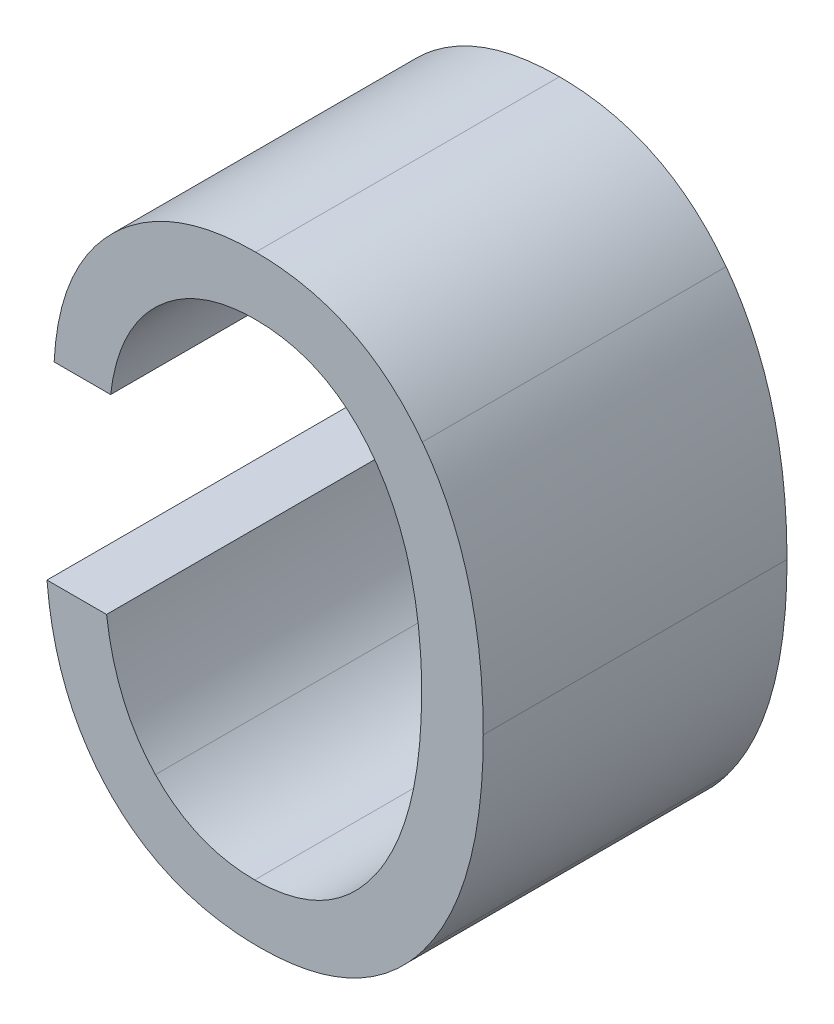
ISO-10303-21;
HEADER;
FILE_DESCRIPTION(('STEP AP214'),'2;1');
FILE_NAME('part.step','',(''),(''),'','','');
FILE_SCHEMA(('AUTOMOTIVE_DESIGN { 1 0 10303 214 1 1 1 1 }'));
ENDSEC;
DATA;
#1=APPLICATION_CONTEXT('core data for automotive mechanical design processes');
#2=APPLICATION_PROTOCOL_DEFINITION('international standard','automotive_design',2000,#1);
#3=PRODUCT_CONTEXT('',#1,'mechanical');
#4=PRODUCT('Part','Part','',(#3));
#5=PRODUCT_RELATED_PRODUCT_CATEGORY('part','',(#4));
#6=PRODUCT_DEFINITION_FORMATION('','',#4);
#7=PRODUCT_DEFINITION_CONTEXT('part definition',#1,'design');
#8=PRODUCT_DEFINITION('design','',#6,#7);
#9=PRODUCT_DEFINITION_SHAPE('','',#8);
#10=(LENGTH_UNIT() NAMED_UNIT(*) SI_UNIT(.MILLI.,.METRE.));
#11=(NAMED_UNIT(*) PLANE_ANGLE_UNIT() SI_UNIT($,.RADIAN.));
#12=(NAMED_UNIT(*) SI_UNIT($,.STERADIAN.) SOLID_ANGLE_UNIT());
#13=UNCERTAINTY_MEASURE_WITH_UNIT(LENGTH_MEASURE(1.E-05),#10,'distance_accuracy_value','');
#14=(GEOMETRIC_REPRESENTATION_CONTEXT(3) GLOBAL_UNCERTAINTY_ASSIGNED_CONTEXT((#13)) GLOBAL_UNIT_ASSIGNED_CONTEXT((#10,
#11,#12)) REPRESENTATION_CONTEXT('',''));
#15=CARTESIAN_POINT('',(0.,0.,0.));
#16=DIRECTION('',(0.,0.,1.));
#17=DIRECTION('',(1.,0.,0.));
#18=AXIS2_PLACEMENT_3D('',#15,#16,#17);
#19=CARTESIAN_POINT('',(-20.748700900759,-5.204237152856,-5.5));
#20=DIRECTION('',(0.,0.,1.));
#21=DIRECTION('',(0.,-1.,0.));
#22=AXIS2_PLACEMENT_3D('',#19,#20,#21);
#23=PLANE('',#22);
#24=DIRECTION('',(-1.,0.,0.));
#25=VECTOR('',#24,1.);
#26=CARTESIAN_POINT('',(-21.315617358079,-5.489666705857,-5.5));
#27=LINE('',#26,#25);
#28=CARTESIAN_POINT('',(-21.315617358079,-5.489666705857,-5.5));
#29=VERTEX_POINT('',#28);
#30=CARTESIAN_POINT('',(-21.511677135857,-5.489666705857,-5.5));
#31=VERTEX_POINT('',#30);
#32=EDGE_CURVE('E220',#29,#31,#27,.T.);
#33=ORIENTED_EDGE('',*,*,#32,.T.);
#34=CARTESIAN_POINT('',(50.6368316811641,55.9876875106243,-5.5));
#35=DIRECTION('',(0.,0.,1.));
#36=DIRECTION('',(-0.757876184757265,-0.652398412458041,0.));
#37=AXIS2_PLACEMENT_3D('',#34,#35,#36);
#38=ELLIPSE('',#37,94.9605156450385,7.90822990046057);
#39=CARTESIAN_POINT('',(-21.297865580301,-6.000615928079,-5.5));
#40=VERTEX_POINT('',#39);
#41=EDGE_CURVE('E351',#31,#40,#38,.T.);
#42=ORIENTED_EDGE('',*,*,#41,.T.);
#43=CARTESIAN_POINT('',(-21.297865580301,-6.000615928079,-5.5));
#44=CARTESIAN_POINT('',(-21.173256002523,-6.125011016968,-5.5));
#45=CARTESIAN_POINT('',(-21.011277380301,-6.187145061412,-5.5));
#46=CARTESIAN_POINT('',(-20.81177166919,-6.187145061412,-5.5));
#47=(BOUNDED_CURVE() B_SPLINE_CURVE(3,(#43,#44,#45,#46),.UNSPECIFIED.,.F.,
.F.) B_SPLINE_CURVE_WITH_KNOTS((4,4),(0.,1.),
.UNSPECIFIED.) CURVE() GEOMETRIC_REPRESENTATION_ITEM() RATIONAL_B_SPLINE_CURVE((1.,1.,1.,1.)) REPRESENTATION_ITEM(''));
#48=CARTESIAN_POINT('',(-20.81177166919,-6.187145061412,-5.5));
#49=VERTEX_POINT('',#48);
#50=EDGE_CURVE('E308',#40,#49,#47,.T.);
#51=ORIENTED_EDGE('',*,*,#50,.T.);
#52=CARTESIAN_POINT('',(-85.6003074763474,111.475848994198,-5.5));
#53=DIRECTION('',(0.,0.,1.));
#54=DIRECTION('',(-0.484502710728714,0.874789759483116,0.));
#55=AXIS2_PLACEMENT_3D('',#52,#53,#54);
#56=ELLIPSE('',#55,134.412425984334,8.97509897320417);
#57=CARTESIAN_POINT('',(-20.272673602523,-5.925753661412,-5.5));
#58=VERTEX_POINT('',#57);
#59=EDGE_CURVE('E388',#49,#58,#56,.T.);
#60=ORIENTED_EDGE('',*,*,#59,.T.);
#61=CARTESIAN_POINT('',(-335.159539741306,295.360115025311,-5.5));
#62=DIRECTION('',(0.,0.,1.));
#63=DIRECTION('',(-0.722391760181757,0.691484016316721,0.));
#64=AXIS2_PLACEMENT_3D('',#61,#62,#63);
#65=ELLIPSE('',#64,435.811574095691,18.4157328264147);
#66=CARTESIAN_POINT('',(-20.075417202523,-5.21274743919,-5.5));
#67=VERTEX_POINT('',#66);
#68=EDGE_CURVE('E342',#58,#67,#65,.T.);
#69=ORIENTED_EDGE('',*,*,#68,.T.);
#70=CARTESIAN_POINT('',(-20.075417202523,-5.21274743919,-5.5));
#71=CARTESIAN_POINT('',(-20.075417202523,-4.90106686141222,-5.5));
#72=CARTESIAN_POINT('',(-20.142092202523,-4.656535416968,-5.5));
#73=CARTESIAN_POINT('',(-20.275848602523,-4.478292328079,-5.5));
#74=(BOUNDED_CURVE() B_SPLINE_CURVE(3,(#70,#71,#72,#73),.UNSPECIFIED.,.F.,
.F.) B_SPLINE_CURVE_WITH_KNOTS((4,4),(0.,1.),
.UNSPECIFIED.) CURVE() GEOMETRIC_REPRESENTATION_ITEM() RATIONAL_B_SPLINE_CURVE((1.,1.,1.,1.)) REPRESENTATION_ITEM(''));
#75=CARTESIAN_POINT('',(-20.275848602523,-4.478292328079,-5.5));
#76=VERTEX_POINT('',#75);
#77=EDGE_CURVE('E376',#67,#76,#74,.T.);
#78=ORIENTED_EDGE('',*,*,#77,.T.);
#79=CARTESIAN_POINT('',(-264.103364811324,-443.415524832838,-5.5));
#80=DIRECTION('',(0.,0.,1.));
#81=DIRECTION('',(0.485128580811187,0.874442828365653,0.));
#82=AXIS2_PLACEMENT_3D('',#79,#80,#81);
#83=ELLIPSE('',#82,502.174176792857,17.47091635477);
#84=CARTESIAN_POINT('',(-20.824502713635,-4.211129483634,-5.5));
#85=VERTEX_POINT('',#84);
#86=EDGE_CURVE('E101',#76,#85,#83,.T.);
#87=ORIENTED_EDGE('',*,*,#86,.T.);
#88=CARTESIAN_POINT('',(11.7742779570349,-62.9549538033383,-5.5));
#89=DIRECTION('',(0.,0.,1.));
#90=DIRECTION('',(-0.489591961104544,0.871951668168487,0.));
#91=AXIS2_PLACEMENT_3D('',#88,#89,#90);
#92=ELLIPSE('',#91,67.276124785224,6.3488727408022);
#93=CARTESIAN_POINT('',(-21.29096806919,-4.388782728079,-5.5));
#94=VERTEX_POINT('',#93);
#95=EDGE_CURVE('E460',#85,#94,#92,.T.);
#96=ORIENTED_EDGE('',*,*,#95,.T.);
#97=CARTESIAN_POINT('',(28.7477985263709,-38.0166772489034,-5.5));
#98=DIRECTION('',(0.,0.,1.));
#99=DIRECTION('',(-0.831196791139272,0.555978321879349,0.));
#100=AXIS2_PLACEMENT_3D('',#97,#98,#99);
#101=ELLIPSE('',#100,60.3024170758194,6.08196527584888);
#102=CARTESIAN_POINT('',(-21.488089002523,-4.856091928079,-5.5));
#103=VERTEX_POINT('',#102);
#104=EDGE_CURVE('E313',#94,#103,#101,.T.);
#105=ORIENTED_EDGE('',*,*,#104,.T.);
#106=DIRECTION('',(1.,0.,0.));
#107=VECTOR('',#106,1.);
#108=CARTESIAN_POINT('',(-21.488089002523,-4.856091928079,-5.5));
#109=LINE('',#108,#107);
#110=CARTESIAN_POINT('',(-21.302101735857,-4.856091928079,-5.5));
#111=VERTEX_POINT('',#110);
#112=EDGE_CURVE('E261',#103,#111,#109,.T.);
#113=ORIENTED_EDGE('',*,*,#112,.T.);
#114=CARTESIAN_POINT('',(-21.302101735857,-4.856091928079,-5.5));
#115=CARTESIAN_POINT('',(-21.286328335857,-4.719262128079,-5.5));
#116=CARTESIAN_POINT('',(-21.234896158079,-4.609638550301,-5.5));
#117=CARTESIAN_POINT('',(-21.147943491412,-4.527097016968,-5.5));
#118=(BOUNDED_CURVE() B_SPLINE_CURVE(3,(#114,#115,#116,#117),.UNSPECIFIED.,.F.,
.F.) B_SPLINE_CURVE_WITH_KNOTS((4,4),(0.,1.),
.UNSPECIFIED.) CURVE() GEOMETRIC_REPRESENTATION_ITEM() RATIONAL_B_SPLINE_CURVE((1.,1.,1.,1.)) REPRESENTATION_ITEM(''));
#119=CARTESIAN_POINT('',(-21.147943491412,-4.527097016968,-5.5));
#120=VERTEX_POINT('',#119);
#121=EDGE_CURVE('E118',#111,#120,#118,.T.);
#122=ORIENTED_EDGE('',*,*,#121,.T.);
#123=CARTESIAN_POINT('',(-8.39938086997582,-30.0100667373925,-5.5));
#124=DIRECTION('',(0.,0.,-1.));
#125=DIRECTION('',(0.443271526599003,-0.896387390421457,0.));
#126=AXIS2_PLACEMENT_3D('',#123,#124,#125);
#127=ELLIPSE('',#126,28.5139488752439,3.49617213415646);
#128=CARTESIAN_POINT('',(-20.825961802523,-4.403582461412,-5.5));
#129=VERTEX_POINT('',#128);
#130=EDGE_CURVE('E442',#120,#129,#127,.T.);
#131=ORIENTED_EDGE('',*,*,#130,.T.);
#132=CARTESIAN_POINT('',(-20.825961802523,-4.403582461412,-5.5));
#133=CARTESIAN_POINT('',(-20.658014180301,-4.403582461412,-5.5));
#134=CARTESIAN_POINT('',(-20.524796824746,-4.47429323919,-5.5));
#135=CARTESIAN_POINT('',(-20.426171446968,-4.615864372523,-5.5));
#136=(BOUNDED_CURVE() B_SPLINE_CURVE(3,(#132,#133,#134,#135),.UNSPECIFIED.,.F.,
.F.) B_SPLINE_CURVE_WITH_KNOTS((4,4),(0.,1.),
.UNSPECIFIED.) CURVE() GEOMETRIC_REPRESENTATION_ITEM() RATIONAL_B_SPLINE_CURVE((1.,1.,1.,1.)) REPRESENTATION_ITEM(''));
#137=CARTESIAN_POINT('',(-20.426171446968,-4.615864372523,-5.5));
#138=VERTEX_POINT('',#137);
#139=EDGE_CURVE('E238',#129,#138,#136,.T.);
#140=ORIENTED_EDGE('',*,*,#139,.T.);
#141=CARTESIAN_POINT('',(-20.426171446968,-4.615864372523,-5.5));
#142=CARTESIAN_POINT('',(-20.327681535857,-4.757723372523,-5.5));
#143=CARTESIAN_POINT('',(-20.27824466919,-4.94987155030111,-5.5));
#144=CARTESIAN_POINT('',(-20.27824466919,-5.193220483634,-5.5));
#145=(BOUNDED_CURVE() B_SPLINE_CURVE(3,(#141,#142,#143,#144),.UNSPECIFIED.,.F.,
.F.) B_SPLINE_CURVE_WITH_KNOTS((4,4),(0.,1.),
.UNSPECIFIED.) CURVE() GEOMETRIC_REPRESENTATION_ITEM() RATIONAL_B_SPLINE_CURVE((1.,1.,1.,1.)) REPRESENTATION_ITEM(''));
#146=CARTESIAN_POINT('',(-20.27824466919,-5.193220483634,-5.5));
#147=VERTEX_POINT('',#146);
#148=EDGE_CURVE('E240',#138,#147,#145,.T.);
#149=ORIENTED_EDGE('',*,*,#148,.T.);
#150=CARTESIAN_POINT('',(-113.597745486153,91.5759390867857,-5.5));
#151=DIRECTION('',(0.,0.,-1.));
#152=DIRECTION('',(0.690685218083178,-0.72315553618941,0.));
#153=AXIS2_PLACEMENT_3D('',#150,#151,#152);
#154=ELLIPSE('',#153,134.772089511232,9.14082465255237);
#155=CARTESIAN_POINT('',(-20.427503535857,-5.784786483634,-5.5));
#156=VERTEX_POINT('',#155);
#157=EDGE_CURVE('E337',#147,#156,#154,.T.);
#158=ORIENTED_EDGE('',*,*,#157,.T.);
#159=CARTESIAN_POINT('',(-20.427503535857,-5.784786483634,-5.5));
#160=CARTESIAN_POINT('',(-20.527054602523,-5.929749928079,-5.5));
#161=CARTESIAN_POINT('',(-20.660266313635,-6.002673328079,-5.5));
#162=CARTESIAN_POINT('',(-20.827686180301,-6.002673328079,-5.5));
#163=(BOUNDED_CURVE() B_SPLINE_CURVE(3,(#159,#160,#161,#162),.UNSPECIFIED.,.F.,
.F.) B_SPLINE_CURVE_WITH_KNOTS((4,4),(0.,1.),
.UNSPECIFIED.) CURVE() GEOMETRIC_REPRESENTATION_ITEM() RATIONAL_B_SPLINE_CURVE((1.,1.,1.,1.)) REPRESENTATION_ITEM(''));
#164=CARTESIAN_POINT('',(-20.827686180301,-6.002673328079,-5.5));
#165=VERTEX_POINT('',#164);
#166=EDGE_CURVE('E274',#156,#165,#163,.T.);
#167=ORIENTED_EDGE('',*,*,#166,.T.);
#168=CARTESIAN_POINT('',(-20.827686180301,-6.002673328079,-5.5));
#169=CARTESIAN_POINT('',(-20.958256291412,-6.002673328079,-5.5));
#170=CARTESIAN_POINT('',(-21.067222291412,-5.957108550301,-5.5));
#171=CARTESIAN_POINT('',(-21.154708358079,-5.865843528079,-5.5));
#172=(BOUNDED_CURVE() B_SPLINE_CURVE(3,(#168,#169,#170,#171),.UNSPECIFIED.,.F.,
.F.) B_SPLINE_CURVE_WITH_KNOTS((4,4),(0.,1.),
.UNSPECIFIED.) CURVE() GEOMETRIC_REPRESENTATION_ITEM() RATIONAL_B_SPLINE_CURVE((1.,1.,1.,1.)) REPRESENTATION_ITEM(''));
#173=CARTESIAN_POINT('',(-21.154708358079,-5.865843528079,-5.5));
#174=VERTEX_POINT('',#173);
#175=EDGE_CURVE('E203',#165,#174,#172,.T.);
#176=ORIENTED_EDGE('',*,*,#175,.T.);
#177=CARTESIAN_POINT('',(-1.67887258777869,14.1211649618847,-5.5));
#178=DIRECTION('',(0.,0.,-1.));
#179=DIRECTION('',(-0.697447655100145,-0.716635729220438,0.));
#180=AXIS2_PLACEMENT_3D('',#177,#178,#179);
#181=ELLIPSE('',#180,27.9070782529669,3.72007615634696);
#182=EDGE_CURVE('E11',#174,#29,#181,.T.);
#183=ORIENTED_EDGE('',*,*,#182,.T.);
#184=EDGE_LOOP('',(#33,#42,#51,#60,#69,#78,#87,#96,#105,#113,#122,#131,#140,#149,#158,#167,#176,#183));
#185=FACE_BOUND('',#184,.T.);
#186=ADVANCED_FACE('F16',(#185),#23,.T.);
#187=CARTESIAN_POINT('',(-20.748700900759,-5.204237152856,-6.5));
#188=DIRECTION('',(0.,0.,1.));
#189=DIRECTION('',(0.,-1.,0.));
#190=AXIS2_PLACEMENT_3D('',#187,#188,#189);
#191=PLANE('',#190);
#192=DIRECTION('',(-1.,0.,0.));
#193=VECTOR('',#192,1.);
#194=CARTESIAN_POINT('',(-21.315617358079,-5.489666705857,-6.5));
#195=LINE('',#194,#193);
#196=CARTESIAN_POINT('',(-21.315617358079,-5.489666705857,-6.5));
#197=VERTEX_POINT('',#196);
#198=CARTESIAN_POINT('',(-21.511677135857,-5.489666705857,-6.5));
#199=VERTEX_POINT('',#198);
#200=EDGE_CURVE('E207',#197,#199,#195,.T.);
#201=ORIENTED_EDGE('',*,*,#200,.F.);
#202=CARTESIAN_POINT('',(-1.67887258777869,14.1211649618847,-6.5));
#203=DIRECTION('',(0.,0.,-1.));
#204=DIRECTION('',(-0.697447655100145,-0.716635729220438,0.));
#205=AXIS2_PLACEMENT_3D('',#202,#203,#204);
#206=ELLIPSE('',#205,27.9070782529669,3.72007615634696);
#207=CARTESIAN_POINT('',(-21.154708358079,-5.865843528079,-6.5));
#208=VERTEX_POINT('',#207);
#209=EDGE_CURVE('E28',#208,#197,#206,.T.);
#210=ORIENTED_EDGE('',*,*,#209,.F.);
#211=CARTESIAN_POINT('',(-20.827686180301,-6.002673328079,-6.5));
#212=CARTESIAN_POINT('',(-20.958256291412,-6.002673328079,-6.5));
#213=CARTESIAN_POINT('',(-21.067222291412,-5.957108550301,-6.5));
#214=CARTESIAN_POINT('',(-21.154708358079,-5.865843528079,-6.5));
#215=(BOUNDED_CURVE() B_SPLINE_CURVE(3,(#211,#212,#213,#214),.UNSPECIFIED.,.F.,
.F.) B_SPLINE_CURVE_WITH_KNOTS((4,4),(0.,1.),
.UNSPECIFIED.) CURVE() GEOMETRIC_REPRESENTATION_ITEM() RATIONAL_B_SPLINE_CURVE((1.,1.,1.,1.)) REPRESENTATION_ITEM(''));
#216=CARTESIAN_POINT('',(-20.827686180301,-6.002673328079,-6.5));
#217=VERTEX_POINT('',#216);
#218=EDGE_CURVE('E233',#217,#208,#215,.T.);
#219=ORIENTED_EDGE('',*,*,#218,.F.);
#220=CARTESIAN_POINT('',(-20.427503535857,-5.784786483634,-6.5));
#221=CARTESIAN_POINT('',(-20.527054602523,-5.929749928079,-6.5));
#222=CARTESIAN_POINT('',(-20.660266313635,-6.002673328079,-6.5));
#223=CARTESIAN_POINT('',(-20.827686180301,-6.002673328079,-6.5));
#224=(BOUNDED_CURVE() B_SPLINE_CURVE(3,(#220,#221,#222,#223),.UNSPECIFIED.,.F.,
.F.) B_SPLINE_CURVE_WITH_KNOTS((4,4),(0.,1.),
.UNSPECIFIED.) CURVE() GEOMETRIC_REPRESENTATION_ITEM() RATIONAL_B_SPLINE_CURVE((1.,1.,1.,1.)) REPRESENTATION_ITEM(''));
#225=CARTESIAN_POINT('',(-20.427503535857,-5.784786483634,-6.5));
#226=VERTEX_POINT('',#225);
#227=EDGE_CURVE('E228',#226,#217,#224,.T.);
#228=ORIENTED_EDGE('',*,*,#227,.F.);
#229=CARTESIAN_POINT('',(-113.597745486153,91.5759390867857,-6.5));
#230=DIRECTION('',(0.,0.,-1.));
#231=DIRECTION('',(0.690685218083178,-0.72315553618941,0.));
#232=AXIS2_PLACEMENT_3D('',#229,#230,#231);
#233=ELLIPSE('',#232,134.772089511232,9.14082465255237);
#234=CARTESIAN_POINT('',(-20.27824466919,-5.193220483634,-6.5));
#235=VERTEX_POINT('',#234);
#236=EDGE_CURVE('E246',#235,#226,#233,.T.);
#237=ORIENTED_EDGE('',*,*,#236,.F.);
#238=CARTESIAN_POINT('',(-20.426171446968,-4.615864372523,-6.5));
#239=CARTESIAN_POINT('',(-20.327681535857,-4.757723372523,-6.5));
#240=CARTESIAN_POINT('',(-20.27824466919,-4.94987155030111,-6.5));
#241=CARTESIAN_POINT('',(-20.27824466919,-5.193220483634,-6.5));
#242=(BOUNDED_CURVE() B_SPLINE_CURVE(3,(#238,#239,#240,#241),.UNSPECIFIED.,.F.,
.F.) B_SPLINE_CURVE_WITH_KNOTS((4,4),(0.,1.),
.UNSPECIFIED.) CURVE() GEOMETRIC_REPRESENTATION_ITEM() RATIONAL_B_SPLINE_CURVE((1.,1.,1.,1.)) REPRESENTATION_ITEM(''));
#243=CARTESIAN_POINT('',(-20.426171446968,-4.615864372523,-6.5));
#244=VERTEX_POINT('',#243);
#245=EDGE_CURVE('E273',#244,#235,#242,.T.);
#246=ORIENTED_EDGE('',*,*,#245,.F.);
#247=CARTESIAN_POINT('',(-20.825961802523,-4.403582461412,-6.5));
#248=CARTESIAN_POINT('',(-20.658014180301,-4.403582461412,-6.5));
#249=CARTESIAN_POINT('',(-20.524796824746,-4.47429323919,-6.5));
#250=CARTESIAN_POINT('',(-20.426171446968,-4.615864372523,-6.5));
#251=(BOUNDED_CURVE() B_SPLINE_CURVE(3,(#247,#248,#249,#250),.UNSPECIFIED.,.F.,
.F.) B_SPLINE_CURVE_WITH_KNOTS((4,4),(0.,1.),
.UNSPECIFIED.) CURVE() GEOMETRIC_REPRESENTATION_ITEM() RATIONAL_B_SPLINE_CURVE((1.,1.,1.,1.)) REPRESENTATION_ITEM(''));
#252=CARTESIAN_POINT('',(-20.825961802523,-4.403582461412,-6.5));
#253=VERTEX_POINT('',#252);
#254=EDGE_CURVE('E239',#253,#244,#251,.T.);
#255=ORIENTED_EDGE('',*,*,#254,.F.);
#256=CARTESIAN_POINT('',(-8.39938086997582,-30.0100667373925,-6.5));
#257=DIRECTION('',(0.,0.,-1.));
#258=DIRECTION('',(0.443271526599003,-0.896387390421457,0.));
#259=AXIS2_PLACEMENT_3D('',#256,#257,#258);
#260=ELLIPSE('',#259,28.5139488752439,3.49617213415646);
#261=CARTESIAN_POINT('',(-21.147943491412,-4.527097016968,-6.5));
#262=VERTEX_POINT('',#261);
#263=EDGE_CURVE('E248',#262,#253,#260,.T.);
#264=ORIENTED_EDGE('',*,*,#263,.F.);
#265=CARTESIAN_POINT('',(-21.302101735857,-4.856091928079,-6.5));
#266=CARTESIAN_POINT('',(-21.286328335857,-4.719262128079,-6.5));
#267=CARTESIAN_POINT('',(-21.234896158079,-4.609638550301,-6.5));
#268=CARTESIAN_POINT('',(-21.147943491412,-4.527097016968,-6.5));
#269=(BOUNDED_CURVE() B_SPLINE_CURVE(3,(#265,#266,#267,#268),.UNSPECIFIED.,.F.,
.F.) B_SPLINE_CURVE_WITH_KNOTS((4,4),(0.,1.),
.UNSPECIFIED.) CURVE() GEOMETRIC_REPRESENTATION_ITEM() RATIONAL_B_SPLINE_CURVE((1.,1.,1.,1.)) REPRESENTATION_ITEM(''));
#270=CARTESIAN_POINT('',(-21.302101735857,-4.856091928079,-6.5));
#271=VERTEX_POINT('',#270);
#272=EDGE_CURVE('E131',#271,#262,#269,.T.);
#273=ORIENTED_EDGE('',*,*,#272,.F.);
#274=DIRECTION('',(1.,0.,0.));
#275=VECTOR('',#274,1.);
#276=CARTESIAN_POINT('',(-21.488089002523,-4.856091928079,-6.5));
#277=LINE('',#276,#275);
#278=CARTESIAN_POINT('',(-21.488089002523,-4.856091928079,-6.5));
#279=VERTEX_POINT('',#278);
#280=EDGE_CURVE('E296',#279,#271,#277,.T.);
#281=ORIENTED_EDGE('',*,*,#280,.F.);
#282=CARTESIAN_POINT('',(28.7477985263709,-38.0166772489034,-6.5));
#283=DIRECTION('',(0.,0.,1.));
#284=DIRECTION('',(-0.831196791139272,0.555978321879349,0.));
#285=AXIS2_PLACEMENT_3D('',#282,#283,#284);
#286=ELLIPSE('',#285,60.3024170758194,6.08196527584888);
#287=CARTESIAN_POINT('',(-21.29096806919,-4.388782728079,-6.5));
#288=VERTEX_POINT('',#287);
#289=EDGE_CURVE('E321',#288,#279,#286,.T.);
#290=ORIENTED_EDGE('',*,*,#289,.F.);
#291=CARTESIAN_POINT('',(11.7742779570349,-62.9549538033383,-6.5));
#292=DIRECTION('',(0.,0.,1.));
#293=DIRECTION('',(-0.489591961104544,0.871951668168487,0.));
#294=AXIS2_PLACEMENT_3D('',#291,#292,#293);
#295=ELLIPSE('',#294,67.276124785224,6.3488727408022);
#296=CARTESIAN_POINT('',(-20.824502713635,-4.211129483634,-6.5));
#297=VERTEX_POINT('',#296);
#298=EDGE_CURVE('E84',#297,#288,#295,.T.);
#299=ORIENTED_EDGE('',*,*,#298,.F.);
#300=CARTESIAN_POINT('',(-264.103364811324,-443.415524832838,-6.5));
#301=DIRECTION('',(0.,0.,1.));
#302=DIRECTION('',(0.485128580811187,0.874442828365653,0.));
#303=AXIS2_PLACEMENT_3D('',#300,#301,#302);
#304=ELLIPSE('',#303,502.174176792857,17.47091635477);
#305=CARTESIAN_POINT('',(-20.275848602523,-4.478292328079,-6.5));
#306=VERTEX_POINT('',#305);
#307=EDGE_CURVE('E300',#306,#297,#304,.T.);
#308=ORIENTED_EDGE('',*,*,#307,.F.);
#309=CARTESIAN_POINT('',(-20.075417202523,-5.21274743919,-6.5));
#310=CARTESIAN_POINT('',(-20.075417202523,-4.90106686141222,-6.5));
#311=CARTESIAN_POINT('',(-20.142092202523,-4.656535416968,-6.5));
#312=CARTESIAN_POINT('',(-20.275848602523,-4.478292328079,-6.5));
#313=(BOUNDED_CURVE() B_SPLINE_CURVE(3,(#309,#310,#311,#312),.UNSPECIFIED.,.F.,
.F.) B_SPLINE_CURVE_WITH_KNOTS((4,4),(0.,1.),
.UNSPECIFIED.) CURVE() GEOMETRIC_REPRESENTATION_ITEM() RATIONAL_B_SPLINE_CURVE((1.,1.,1.,1.)) REPRESENTATION_ITEM(''));
#314=CARTESIAN_POINT('',(-20.075417202523,-5.21274743919,-6.5));
#315=VERTEX_POINT('',#314);
#316=EDGE_CURVE('E384',#315,#306,#313,.T.);
#317=ORIENTED_EDGE('',*,*,#316,.F.);
#318=CARTESIAN_POINT('',(-335.159539741306,295.360115025311,-6.5));
#319=DIRECTION('',(0.,0.,1.));
#320=DIRECTION('',(-0.722391760181757,0.691484016316721,0.));
#321=AXIS2_PLACEMENT_3D('',#318,#319,#320);
#322=ELLIPSE('',#321,435.811574095691,18.4157328264147);
#323=CARTESIAN_POINT('',(-20.272673602523,-5.925753661412,-6.5));
#324=VERTEX_POINT('',#323);
#325=EDGE_CURVE('E343',#324,#315,#322,.T.);
#326=ORIENTED_EDGE('',*,*,#325,.F.);
#327=CARTESIAN_POINT('',(-85.6003074763474,111.475848994198,-6.5));
#328=DIRECTION('',(0.,0.,1.));
#329=DIRECTION('',(-0.484502710728714,0.874789759483116,0.));
#330=AXIS2_PLACEMENT_3D('',#327,#328,#329);
#331=ELLIPSE('',#330,134.412425984334,8.97509897320417);
#332=CARTESIAN_POINT('',(-20.81177166919,-6.187145061412,-6.5));
#333=VERTEX_POINT('',#332);
#334=EDGE_CURVE('E303',#333,#324,#331,.T.);
#335=ORIENTED_EDGE('',*,*,#334,.F.);
#336=CARTESIAN_POINT('',(-21.297865580301,-6.000615928079,-6.5));
#337=CARTESIAN_POINT('',(-21.173256002523,-6.125011016968,-6.5));
#338=CARTESIAN_POINT('',(-21.011277380301,-6.187145061412,-6.5));
#339=CARTESIAN_POINT('',(-20.81177166919,-6.187145061412,-6.5));
#340=(BOUNDED_CURVE() B_SPLINE_CURVE(3,(#336,#337,#338,#339),.UNSPECIFIED.,.F.,
.F.) B_SPLINE_CURVE_WITH_KNOTS((4,4),(0.,1.),
.UNSPECIFIED.) CURVE() GEOMETRIC_REPRESENTATION_ITEM() RATIONAL_B_SPLINE_CURVE((1.,1.,1.,1.)) REPRESENTATION_ITEM(''));
#341=CARTESIAN_POINT('',(-21.297865580301,-6.000615928079,-6.5));
#342=VERTEX_POINT('',#341);
#343=EDGE_CURVE('E344',#342,#333,#340,.T.);
#344=ORIENTED_EDGE('',*,*,#343,.F.);
#345=CARTESIAN_POINT('',(50.6368316811641,55.9876875106243,-6.5));
#346=DIRECTION('',(0.,0.,1.));
#347=DIRECTION('',(-0.757876184757265,-0.652398412458041,0.));
#348=AXIS2_PLACEMENT_3D('',#345,#346,#347);
#349=ELLIPSE('',#348,94.9605156450385,7.90822990046057);
#350=EDGE_CURVE('E210',#199,#342,#349,.T.);
#351=ORIENTED_EDGE('',*,*,#350,.F.);
#352=EDGE_LOOP('',(#201,#210,#219,#228,#237,#246,#255,#264,#273,#281,#290,#299,#308,#317,#326,
#335,#344,#351));
#353=FACE_BOUND('',#352,.T.);
#354=ADVANCED_FACE('F208',(#353),#191,.F.);
#355=CARTESIAN_POINT('',(-21.1540156470859,-5.86656461988799,-6.50000000000001));
#356=CARTESIAN_POINT('',(-21.2860358089349,-5.7294120969401,-6.50000000000001));
#357=CARTESIAN_POINT('',(-21.3157403535357,-5.48867387871334,-6.5));
#358=CARTESIAN_POINT('',(-21.1540156470859,-5.86656461988799,-5.5));
#359=CARTESIAN_POINT('',(-21.2860358089349,-5.7294120969401,-5.5));
#360=CARTESIAN_POINT('',(-21.3157403535357,-5.48867387871334,-5.50000000000001));
#361=(BOUNDED_SURFACE() B_SPLINE_SURFACE(1,2,((#355,#356,#357),(#358,#359,#360)),.UNSPECIFIED.,
.F.,.F.,.F.) B_SPLINE_SURFACE_WITH_KNOTS((2,2),(3,3),(-0.0359279062920868,
-9.47748538665111E-05),(87.8076101710091,90.9074252622844),
.UNSPECIFIED.) GEOMETRIC_REPRESENTATION_ITEM() RATIONAL_B_SPLINE_SURFACE(((0.998204696278694,
0.977620614001062,0.959965675302221),(0.998204696278694,0.977620614001062,0.959965675302221))) REPRESENTATION_ITEM('') SURFACE());
#362=DIRECTION('',(0.,0.,1.));
#363=VECTOR('',#362,1.);
#364=CARTESIAN_POINT('',(-21.154708358079,-5.865843528079,-6.5));
#365=LINE('',#364,#363);
#366=EDGE_CURVE('E200',#208,#174,#365,.T.);
#367=DIRECTION('',(0.,0.,1.));
#368=VECTOR('',#367,1.);
#369=CARTESIAN_POINT('',(-21.315617358079,-5.489666705857,-6.5));
#370=LINE('',#369,#368);
#371=EDGE_CURVE('E198',#197,#29,#370,.T.);
#372=ORIENTED_EDGE('',*,*,#366,.F.);
#373=ORIENTED_EDGE('',*,*,#209,.T.);
#374=ORIENTED_EDGE('',*,*,#371,.T.);
#375=ORIENTED_EDGE('',*,*,#182,.F.);
#376=EDGE_LOOP('',(#372,#373,#374,#375));
#377=FACE_BOUND('',#376,.T.);
#378=ADVANCED_FACE('F196',(#377),#361,.F.);
#379=CARTESIAN_POINT('',(-20.827686180301,-6.002673328079,-5.49717874474177));
#380=CARTESIAN_POINT('',(-20.827686180301,-6.002673328079,-6.50282125525823));
#381=CARTESIAN_POINT('',(-20.958256291412,-6.002673328079,-5.49717874474177));
#382=CARTESIAN_POINT('',(-20.958256291412,-6.002673328079,-6.50282125525823));
#383=CARTESIAN_POINT('',(-21.067222291412,-5.957108550301,-5.49717874474177));
#384=CARTESIAN_POINT('',(-21.067222291412,-5.957108550301,-6.50282125525823));
#385=CARTESIAN_POINT('',(-21.154708358079,-5.865843528079,-5.49717874474177));
#386=CARTESIAN_POINT('',(-21.154708358079,-5.865843528079,-6.50282125525823));
#387=(BOUNDED_SURFACE() B_SPLINE_SURFACE(3,1,((#379,#380),(#381,#382),(#383,#384),(#385,#386)),
.UNSPECIFIED.,.F.,.F.,.F.) B_SPLINE_SURFACE_WITH_KNOTS((4,4),(2,2),(0.,1.),(-1.00282125525823,
0.00282125525822873),
.UNSPECIFIED.) GEOMETRIC_REPRESENTATION_ITEM() RATIONAL_B_SPLINE_SURFACE(((1.,1.),(1.,1.),(1.,
1.),(1.,1.))) REPRESENTATION_ITEM('') SURFACE());
#388=DIRECTION('',(0.,0.,1.));
#389=VECTOR('',#388,1.);
#390=CARTESIAN_POINT('',(-20.827686180301,-6.002673328079,-6.5));
#391=LINE('',#390,#389);
#392=EDGE_CURVE('E283',#217,#165,#391,.T.);
#393=ORIENTED_EDGE('',*,*,#392,.F.);
#394=ORIENTED_EDGE('',*,*,#218,.T.);
#395=ORIENTED_EDGE('',*,*,#366,.T.);
#396=ORIENTED_EDGE('',*,*,#175,.F.);
#397=EDGE_LOOP('',(#393,#394,#395,#396));
#398=FACE_BOUND('',#397,.T.);
#399=ADVANCED_FACE('F18',(#398),#387,.F.);
#400=CARTESIAN_POINT('',(-20.427503535857,-5.784786483634,-5.49780528364434));
#401=CARTESIAN_POINT('',(-20.427503535857,-5.784786483634,-6.50219471635566));
#402=CARTESIAN_POINT('',(-20.527054602523,-5.929749928079,-5.49780528364434));
#403=CARTESIAN_POINT('',(-20.527054602523,-5.929749928079,-6.50219471635566));
#404=CARTESIAN_POINT('',(-20.660266313635,-6.002673328079,-5.49780528364434));
#405=CARTESIAN_POINT('',(-20.660266313635,-6.002673328079,-6.50219471635566));
#406=CARTESIAN_POINT('',(-20.827686180301,-6.002673328079,-5.49780528364434));
#407=CARTESIAN_POINT('',(-20.827686180301,-6.002673328079,-6.50219471635566));
#408=(BOUNDED_SURFACE() B_SPLINE_SURFACE(3,1,((#400,#401),(#402,#403),(#404,#405),(#406,#407)),
.UNSPECIFIED.,.F.,.F.,.F.) B_SPLINE_SURFACE_WITH_KNOTS((4,4),(2,2),(0.,1.),(-1.00219471635566,
0.00219471635566222),
.UNSPECIFIED.) GEOMETRIC_REPRESENTATION_ITEM() RATIONAL_B_SPLINE_SURFACE(((1.,1.),(1.,1.),(1.,
1.),(1.,1.))) REPRESENTATION_ITEM('') SURFACE());
#409=DIRECTION('',(0.,0.,1.));
#410=VECTOR('',#409,1.);
#411=CARTESIAN_POINT('',(-20.427503535857,-5.784786483634,-6.5));
#412=LINE('',#411,#410);
#413=EDGE_CURVE('E312',#226,#156,#412,.T.);
#414=ORIENTED_EDGE('',*,*,#413,.F.);
#415=ORIENTED_EDGE('',*,*,#227,.T.);
#416=ORIENTED_EDGE('',*,*,#392,.T.);
#417=ORIENTED_EDGE('',*,*,#166,.F.);
#418=EDGE_LOOP('',(#414,#415,#416,#417));
#419=FACE_BOUND('',#418,.T.);
#420=ADVANCED_FACE('F524',(#419),#408,.F.);
#421=CARTESIAN_POINT('',(-20.2782449369791,-5.19222019185022,-6.5));
#422=CARTESIAN_POINT('',(-20.2780442854351,-5.56710565217208,-6.5));
#423=CARTESIAN_POINT('',(-20.4280688320596,-5.78561115305205,-6.50000000000001));
#424=CARTESIAN_POINT('',(-20.2782449369791,-5.19222019185022,-5.50000000000001));
#425=CARTESIAN_POINT('',(-20.2780442854351,-5.56710565217208,-5.5));
#426=CARTESIAN_POINT('',(-20.4280688320596,-5.78561115305205,-5.5));
#427=(BOUNDED_SURFACE() B_SPLINE_SURFACE(1,2,((#421,#422,#423),(#424,#425,#426)),.UNSPECIFIED.,
.F.,.F.,.F.) B_SPLINE_SURFACE_WITH_KNOTS((2,2),(3,3),(-0.00743411090652499,
-1.40509883059838E-05),(412.917728848257,421.269305528968),
.UNSPECIFIED.) GEOMETRIC_REPRESENTATION_ITEM() RATIONAL_B_SPLINE_SURFACE(((0.972451009125255,
0.982862483690012,0.994185656941007),(0.972451009125255,0.982862483690012,0.994185656941007))) REPRESENTATION_ITEM('') SURFACE());
#428=DIRECTION('',(0.,0.,1.));
#429=VECTOR('',#428,1.);
#430=CARTESIAN_POINT('',(-20.27824466919,-5.193220483634,-6.5));
#431=LINE('',#430,#429);
#432=EDGE_CURVE('E247',#235,#147,#431,.T.);
#433=ORIENTED_EDGE('',*,*,#432,.F.);
#434=ORIENTED_EDGE('',*,*,#236,.T.);
#435=ORIENTED_EDGE('',*,*,#413,.T.);
#436=ORIENTED_EDGE('',*,*,#157,.F.);
#437=EDGE_LOOP('',(#433,#434,#435,#436));
#438=FACE_BOUND('',#437,.T.);
#439=ADVANCED_FACE('F520',(#438),#427,.F.);
#440=CARTESIAN_POINT('',(-20.426171446968,-4.615864372523,-5.49806983665586));
#441=CARTESIAN_POINT('',(-20.426171446968,-4.615864372523,-6.50193016334414));
#442=CARTESIAN_POINT('',(-20.327681535857,-4.757723372523,-5.49806983665586));
#443=CARTESIAN_POINT('',(-20.327681535857,-4.757723372523,-6.50193016334414));
#444=CARTESIAN_POINT('',(-20.27824466919,-4.94987155030111,-5.49806983665586));
#445=CARTESIAN_POINT('',(-20.27824466919,-4.94987155030111,-6.50193016334414));
#446=CARTESIAN_POINT('',(-20.27824466919,-5.193220483634,-5.49806983665586));
#447=CARTESIAN_POINT('',(-20.27824466919,-5.193220483634,-6.50193016334414));
#448=(BOUNDED_SURFACE() B_SPLINE_SURFACE(3,1,((#440,#441),(#442,#443),(#444,#445),(#446,#447)),
.UNSPECIFIED.,.F.,.F.,.F.) B_SPLINE_SURFACE_WITH_KNOTS((4,4),(2,2),(0.,1.),(-1.00193016334414,
0.00193016334414073),
.UNSPECIFIED.) GEOMETRIC_REPRESENTATION_ITEM() RATIONAL_B_SPLINE_SURFACE(((1.,1.),(1.,1.),(1.,
1.),(1.,1.))) REPRESENTATION_ITEM('') SURFACE());
#449=DIRECTION('',(0.,0.,1.));
#450=VECTOR('',#449,1.);
#451=CARTESIAN_POINT('',(-20.426171446968,-4.615864372523,-6.5));
#452=LINE('',#451,#450);
#453=EDGE_CURVE('E234',#244,#138,#452,.T.);
#454=ORIENTED_EDGE('',*,*,#453,.F.);
#455=ORIENTED_EDGE('',*,*,#245,.T.);
#456=ORIENTED_EDGE('',*,*,#432,.T.);
#457=ORIENTED_EDGE('',*,*,#148,.F.);
#458=EDGE_LOOP('',(#454,#455,#456,#457));
#459=FACE_BOUND('',#458,.T.);
#460=ADVANCED_FACE('F602',(#459),#448,.F.);
#461=CARTESIAN_POINT('',(-20.825961802523,-4.403582461412,-5.49779057405603));
#462=CARTESIAN_POINT('',(-20.825961802523,-4.403582461412,-6.50220942594397));
#463=CARTESIAN_POINT('',(-20.658014180301,-4.403582461412,-5.49779057405603));
#464=CARTESIAN_POINT('',(-20.658014180301,-4.403582461412,-6.50220942594397));
#465=CARTESIAN_POINT('',(-20.524796824746,-4.47429323919,-5.49779057405603));
#466=CARTESIAN_POINT('',(-20.524796824746,-4.47429323919,-6.50220942594397));
#467=CARTESIAN_POINT('',(-20.426171446968,-4.615864372523,-5.49779057405603));
#468=CARTESIAN_POINT('',(-20.426171446968,-4.615864372523,-6.50220942594397));
#469=(BOUNDED_SURFACE() B_SPLINE_SURFACE(3,1,((#461,#462),(#463,#464),(#465,#466),(#467,#468)),
.UNSPECIFIED.,.F.,.F.,.F.) B_SPLINE_SURFACE_WITH_KNOTS((4,4),(2,2),(0.,1.),(-1.00220942594397,
0.00220942594397448),
.UNSPECIFIED.) GEOMETRIC_REPRESENTATION_ITEM() RATIONAL_B_SPLINE_SURFACE(((1.,1.),(1.,1.),(1.,
1.),(1.,1.))) REPRESENTATION_ITEM('') SURFACE());
#470=DIRECTION('',(0.,0.,1.));
#471=VECTOR('',#470,1.);
#472=CARTESIAN_POINT('',(-20.825961802523,-4.403582461412,-6.5));
#473=LINE('',#472,#471);
#474=EDGE_CURVE('E255',#253,#129,#473,.T.);
#475=ORIENTED_EDGE('',*,*,#474,.F.);
#476=ORIENTED_EDGE('',*,*,#254,.T.);
#477=ORIENTED_EDGE('',*,*,#453,.T.);
#478=ORIENTED_EDGE('',*,*,#139,.F.);
#479=EDGE_LOOP('',(#475,#476,#477,#478));
#480=FACE_BOUND('',#479,.T.);
#481=ADVANCED_FACE('F489',(#480),#469,.F.);
#482=CARTESIAN_POINT('',(-21.1487074232471,-4.52782128593283,-6.50000000000001));
#483=CARTESIAN_POINT('',(-21.098335999991,-4.4799623805381,-6.5));
#484=CARTESIAN_POINT('',(-21.0388026902115,-4.4505225987601,-6.5));
#485=CARTESIAN_POINT('',(-20.9434245753393,-4.40335722363425,-6.5));
#486=CARTESIAN_POINT('',(-20.8248305185566,-4.40358354119386,-6.5));
#487=CARTESIAN_POINT('',(-21.1487074232471,-4.52782128593283,-5.5));
#488=CARTESIAN_POINT('',(-21.098335999991,-4.4799623805381,-5.5));
#489=CARTESIAN_POINT('',(-21.0388026902115,-4.4505225987601,-5.5));
#490=CARTESIAN_POINT('',(-20.9434245753393,-4.40335722363425,-5.5));
#491=CARTESIAN_POINT('',(-20.8248305185566,-4.40358354119386,-5.5));
#492=(BOUNDED_SURFACE() B_SPLINE_SURFACE(1,2,((#482,#483,#484,#485,#486),(#487,#488,#489,#490,
#491)),.UNSPECIFIED.,.F.,.F.,.F.) B_SPLINE_SURFACE_WITH_KNOTS((2,2),(3,2,3),
(-0.0351735271082252,-0.000101666131331689),(177.957895528316,179.151751066736,
181.055474092727),
.UNSPECIFIED.) GEOMETRIC_REPRESENTATION_ITEM() RATIONAL_B_SPLINE_SURFACE(((0.984801648029936,
0.992192715072804,1.,0.987550497017378,0.976159332805058),(0.984801648029936,0.992192715072804,
1.,0.987550497017378,0.976159332805058))) REPRESENTATION_ITEM('') SURFACE());
#493=DIRECTION('',(0.,0.,1.));
#494=VECTOR('',#493,1.);
#495=CARTESIAN_POINT('',(-21.147943491412,-4.527097016968,-6.5));
#496=LINE('',#495,#494);
#497=EDGE_CURVE('E260',#262,#120,#496,.T.);
#498=ORIENTED_EDGE('',*,*,#497,.F.);
#499=ORIENTED_EDGE('',*,*,#263,.T.);
#500=ORIENTED_EDGE('',*,*,#474,.T.);
#501=ORIENTED_EDGE('',*,*,#130,.F.);
#502=EDGE_LOOP('',(#498,#499,#500,#501));
#503=FACE_BOUND('',#502,.T.);
#504=ADVANCED_FACE('F480',(#503),#492,.F.);
#505=CARTESIAN_POINT('',(-21.302101735857,-4.856091928079,-5.49721969862587));
#506=CARTESIAN_POINT('',(-21.302101735857,-4.856091928079,-6.50278030137414));
#507=CARTESIAN_POINT('',(-21.286328335857,-4.719262128079,-5.49721969862587));
#508=CARTESIAN_POINT('',(-21.286328335857,-4.719262128079,-6.50278030137414));
#509=CARTESIAN_POINT('',(-21.234896158079,-4.609638550301,-5.49721969862587));
#510=CARTESIAN_POINT('',(-21.234896158079,-4.609638550301,-6.50278030137414));
#511=CARTESIAN_POINT('',(-21.147943491412,-4.527097016968,-5.49721969862587));
#512=CARTESIAN_POINT('',(-21.147943491412,-4.527097016968,-6.50278030137414));
#513=(BOUNDED_SURFACE() B_SPLINE_SURFACE(3,1,((#505,#506),(#507,#508),(#509,#510),(#511,#512)),
.UNSPECIFIED.,.F.,.F.,.F.) B_SPLINE_SURFACE_WITH_KNOTS((4,4),(2,2),(0.,1.),(-1.00278030137414,
0.00278030137413751),
.UNSPECIFIED.) GEOMETRIC_REPRESENTATION_ITEM() RATIONAL_B_SPLINE_SURFACE(((1.,1.),(1.,1.),(1.,
1.),(1.,1.))) REPRESENTATION_ITEM('') SURFACE());
#514=DIRECTION('',(0.,0.,1.));
#515=VECTOR('',#514,1.);
#516=CARTESIAN_POINT('',(-21.302101735857,-4.856091928079,-6.5));
#517=LINE('',#516,#515);
#518=EDGE_CURVE('E267',#271,#111,#517,.T.);
#519=ORIENTED_EDGE('',*,*,#518,.F.);
#520=ORIENTED_EDGE('',*,*,#272,.T.);
#521=ORIENTED_EDGE('',*,*,#497,.T.);
#522=ORIENTED_EDGE('',*,*,#121,.F.);
#523=EDGE_LOOP('',(#519,#520,#521,#522));
#524=FACE_BOUND('',#523,.T.);
#525=ADVANCED_FACE('F478',(#524),#513,.F.);
#526=CARTESIAN_POINT('',(-21.39509536919,-4.856091928079,-5.49));
#527=DIRECTION('',(0.,1.,0.));
#528=DIRECTION('',(-1.,0.,0.));
#529=AXIS2_PLACEMENT_3D('',#526,#527,#528);
#530=PLANE('',#529);
#531=DIRECTION('',(0.,0.,1.));
#532=VECTOR('',#531,1.);
#533=CARTESIAN_POINT('',(-21.488089002523,-4.856091928079,-6.5));
#534=LINE('',#533,#532);
#535=EDGE_CURVE('E317',#279,#103,#534,.T.);
#536=ORIENTED_EDGE('',*,*,#535,.F.);
#537=ORIENTED_EDGE('',*,*,#280,.T.);
#538=ORIENTED_EDGE('',*,*,#518,.T.);
#539=ORIENTED_EDGE('',*,*,#112,.F.);
#540=EDGE_LOOP('',(#536,#537,#538,#539));
#541=FACE_BOUND('',#540,.T.);
#542=ADVANCED_FACE('F477',(#541),#530,.F.);
#543=CARTESIAN_POINT('',(-21.2902501305194,-4.38808634342189,-6.50000000000001));
#544=CARTESIAN_POINT('',(-21.3387041280093,-4.43501398899545,-6.5));
#545=CARTESIAN_POINT('',(-21.3753770169335,-4.48984055513431,-6.5));
#546=CARTESIAN_POINT('',(-21.4777569264136,-4.64290018700575,-6.5));
#547=CARTESIAN_POINT('',(-21.4881379441777,-4.85709106278651,-6.5));
#548=CARTESIAN_POINT('',(-21.2902501305194,-4.38808634342189,-5.50000000000001));
#549=CARTESIAN_POINT('',(-21.3387041280093,-4.43501398899545,-5.5));
#550=CARTESIAN_POINT('',(-21.3753770169335,-4.48984055513431,-5.5));
#551=CARTESIAN_POINT('',(-21.4777569264136,-4.64290018700575,-5.5));
#552=CARTESIAN_POINT('',(-21.4881379441777,-4.85709106278651,-5.5));
#553=(BOUNDED_SURFACE() B_SPLINE_SURFACE(1,2,((#543,#544,#545,#546,#547),(#548,#549,#550,#551,
#552)),.UNSPECIFIED.,.F.,.F.,.F.) B_SPLINE_SURFACE_WITH_KNOTS((2,2),(3,2,3),
(-0.0166160639725938,-3.26899057703639E-05),(187.995994240196,189.442307755383,193.44789282015),
.UNSPECIFIED.) GEOMETRIC_REPRESENTATION_ITEM() RATIONAL_B_SPLINE_SURFACE(((0.991192101290713,
0.995527763297482,1.,0.987614079275623,0.976275714604692),(0.991192101290713,0.995527763297482,
1.,0.987614079275623,0.976275714604692))) REPRESENTATION_ITEM('') SURFACE());
#554=DIRECTION('',(0.,0.,1.));
#555=VECTOR('',#554,1.);
#556=CARTESIAN_POINT('',(-21.29096806919,-4.388782728079,-6.5));
#557=LINE('',#556,#555);
#558=EDGE_CURVE('E357',#288,#94,#557,.T.);
#559=ORIENTED_EDGE('',*,*,#558,.F.);
#560=ORIENTED_EDGE('',*,*,#289,.T.);
#561=ORIENTED_EDGE('',*,*,#535,.T.);
#562=ORIENTED_EDGE('',*,*,#104,.F.);
#563=EDGE_LOOP('',(#559,#560,#561,#562));
#564=FACE_BOUND('',#563,.T.);
#565=ADVANCED_FACE('F487',(#564),#553,.F.);
#566=CARTESIAN_POINT('',(-20.8235023789436,-4.21113003952637,-6.50000000000001));
#567=CARTESIAN_POINT('',(-21.0166251549091,-4.21091552241163,-6.5));
#568=CARTESIAN_POINT('',(-21.1635717536913,-4.29342448245521,-6.5));
#569=CARTESIAN_POINT('',(-21.2327881224376,-4.33228874097205,-6.50000000000001));
#570=CARTESIAN_POINT('',(-21.2916861902002,-4.38947897364519,-6.50000000000001));
#571=CARTESIAN_POINT('',(-20.8235023789436,-4.21113003952637,-5.50000000000001));
#572=CARTESIAN_POINT('',(-21.0166251549091,-4.21091552241163,-5.5));
#573=CARTESIAN_POINT('',(-21.1635717536913,-4.29342448245521,-5.5));
#574=CARTESIAN_POINT('',(-21.2327881224376,-4.33228874097205,-5.50000000000001));
#575=CARTESIAN_POINT('',(-21.2916861902002,-4.38947897364519,-5.5));
#576=(BOUNDED_SURFACE() B_SPLINE_SURFACE(1,2,((#566,#567,#568,#569,#570),(#571,#572,#573,#574,
#575)),.UNSPECIFIED.,.F.,.F.,.F.) B_SPLINE_SURFACE_WITH_KNOTS((2,2),(3,2,3),
(-0.0148944499725506,-2.9775886141982E-05),(207.422399182751,211.346218243848,213.20515193088),
.UNSPECIFIED.) GEOMETRIC_REPRESENTATION_ITEM() RATIONAL_B_SPLINE_SURFACE(((0.979056430520957,
0.989124385528202,1.,0.994847609995771,0.989876495084651),(0.979056430520957,0.989124385528202,
1.,0.994847609995771,0.989876495084651))) REPRESENTATION_ITEM('') SURFACE());
#577=DIRECTION('',(0.,0.,1.));
#578=VECTOR('',#577,1.);
#579=CARTESIAN_POINT('',(-20.824502713635,-4.211129483634,-6.5));
#580=LINE('',#579,#578);
#581=EDGE_CURVE('E297',#297,#85,#580,.T.);
#582=ORIENTED_EDGE('',*,*,#581,.F.);
#583=ORIENTED_EDGE('',*,*,#298,.T.);
#584=ORIENTED_EDGE('',*,*,#558,.T.);
#585=ORIENTED_EDGE('',*,*,#95,.F.);
#586=EDGE_LOOP('',(#582,#583,#584,#585));
#587=FACE_BOUND('',#586,.T.);
#588=ADVANCED_FACE('F550',(#587),#576,.F.);
#589=CARTESIAN_POINT('',(-20.2751891598805,-4.47917347492606,-6.5));
#590=CARTESIAN_POINT('',(-20.3648496370717,-4.35919732588303,-6.5));
#591=CARTESIAN_POINT('',(-20.4843191023114,-4.29291734670203,-6.5));
#592=CARTESIAN_POINT('',(-20.6321812560318,-4.21088550324657,-6.5));
#593=CARTESIAN_POINT('',(-20.8256530587838,-4.2111302113807,-6.50000000000001));
#594=CARTESIAN_POINT('',(-20.2751891598805,-4.47917347492606,-5.5));
#595=CARTESIAN_POINT('',(-20.3648496370717,-4.35919732588303,-5.50000000000001));
#596=CARTESIAN_POINT('',(-20.4843191023114,-4.29291734670203,-5.5));
#597=CARTESIAN_POINT('',(-20.6321812560318,-4.21088550324657,-5.5));
#598=CARTESIAN_POINT('',(-20.8256530587838,-4.2111302113807,-5.50000000000001));
#599=(BOUNDED_SURFACE() B_SPLINE_SURFACE(1,2,((#589,#590,#591,#592,#593),(#594,#595,#596,#597,
#598)),.UNSPECIFIED.,.F.,.F.,.F.) B_SPLINE_SURFACE_WITH_KNOTS((2,2),(3,2,3),
(-0.00199461127117667,-3.26307464773535E-06),(1568.9254754081,1577.62096004396,
1588.37473100184),
.UNSPECIFIED.) GEOMETRIC_REPRESENTATION_ITEM() RATIONAL_B_SPLINE_SURFACE(((0.993613743074285,
0.996771279605628,1.,0.996007017312767,0.99212290645811),(0.993613743074285,0.996771279605628,
1.,0.996007017312767,0.99212290645811))) REPRESENTATION_ITEM('') SURFACE());
#600=DIRECTION('',(0.,0.,1.));
#601=VECTOR('',#600,1.);
#602=CARTESIAN_POINT('',(-20.275848602523,-4.478292328079,-6.5));
#603=LINE('',#602,#601);
#604=EDGE_CURVE('E380',#306,#76,#603,.T.);
#605=ORIENTED_EDGE('',*,*,#604,.F.);
#606=ORIENTED_EDGE('',*,*,#307,.T.);
#607=ORIENTED_EDGE('',*,*,#581,.T.);
#608=ORIENTED_EDGE('',*,*,#86,.F.);
#609=EDGE_LOOP('',(#605,#606,#607,#608));
#610=FACE_BOUND('',#609,.T.);
#611=ADVANCED_FACE('F405',(#610),#599,.F.);
#612=CARTESIAN_POINT('',(-20.075417202523,-5.21274743919,-5.49850421427974));
#613=CARTESIAN_POINT('',(-20.075417202523,-5.21274743919,-6.50149578572026));
#614=CARTESIAN_POINT('',(-20.075417202523,-4.90106686141222,-5.49850421427974));
#615=CARTESIAN_POINT('',(-20.075417202523,-4.90106686141222,-6.50149578572026));
#616=CARTESIAN_POINT('',(-20.142092202523,-4.656535416968,-5.49850421427974));
#617=CARTESIAN_POINT('',(-20.142092202523,-4.656535416968,-6.50149578572026));
#618=CARTESIAN_POINT('',(-20.275848602523,-4.478292328079,-5.49850421427974));
#619=CARTESIAN_POINT('',(-20.275848602523,-4.478292328079,-6.50149578572026));
#620=(BOUNDED_SURFACE() B_SPLINE_SURFACE(3,1,((#612,#613),(#614,#615),(#616,#617),(#618,#619)),
.UNSPECIFIED.,.F.,.F.,.F.) B_SPLINE_SURFACE_WITH_KNOTS((4,4),(2,2),(0.,1.),(-1.00149578572026,
0.0014957857202638),
.UNSPECIFIED.) GEOMETRIC_REPRESENTATION_ITEM() RATIONAL_B_SPLINE_SURFACE(((1.,1.),(1.,1.),(1.,
1.),(1.,1.))) REPRESENTATION_ITEM('') SURFACE());
#621=DIRECTION('',(0.,0.,1.));
#622=VECTOR('',#621,1.);
#623=CARTESIAN_POINT('',(-20.075417202523,-5.21274743919,-6.5));
#624=LINE('',#623,#622);
#625=EDGE_CURVE('E338',#315,#67,#624,.T.);
#626=ORIENTED_EDGE('',*,*,#625,.F.);
#627=ORIENTED_EDGE('',*,*,#316,.T.);
#628=ORIENTED_EDGE('',*,*,#604,.T.);
#629=ORIENTED_EDGE('',*,*,#77,.F.);
#630=EDGE_LOOP('',(#626,#627,#628,#629));
#631=FACE_BOUND('',#630,.T.);
#632=ADVANCED_FACE('F404',(#631),#620,.F.);
#633=CARTESIAN_POINT('',(-20.2732751242439,-5.92655241047766,-6.5));
#634=CARTESIAN_POINT('',(-20.075197980545,-5.66387370683702,-6.5));
#635=CARTESIAN_POINT('',(-20.0754174453402,-5.21174719988569,-6.5));
#636=CARTESIAN_POINT('',(-20.2732751242439,-5.92655241047766,-5.50000000000001));
#637=CARTESIAN_POINT('',(-20.075197980545,-5.66387370683702,-5.5));
#638=CARTESIAN_POINT('',(-20.0754174453402,-5.21174719988569,-5.5));
#639=(BOUNDED_SURFACE() B_SPLINE_SURFACE(1,2,((#633,#634,#635),(#636,#637,#638)),.UNSPECIFIED.,
.F.,.F.,.F.) B_SPLINE_SURFACE_WITH_KNOTS((2,2),(3,3),(-0.00229807436455807,
-3.49596697719456E-06),(2.41086104196524,19.427707285154),
.UNSPECIFIED.) GEOMETRIC_REPRESENTATION_ITEM() RATIONAL_B_SPLINE_SURFACE(((0.997944287622839,
0.990714897493318,0.983847469805475),(0.997944287622839,0.990714897493318,0.983847469805475))) REPRESENTATION_ITEM('') SURFACE());
#640=DIRECTION('',(0.,0.,1.));
#641=VECTOR('',#640,1.);
#642=CARTESIAN_POINT('',(-20.272673602523,-5.925753661412,-6.5));
#643=LINE('',#642,#641);
#644=EDGE_CURVE('E307',#324,#58,#643,.T.);
#645=ORIENTED_EDGE('',*,*,#644,.F.);
#646=ORIENTED_EDGE('',*,*,#325,.T.);
#647=ORIENTED_EDGE('',*,*,#625,.T.);
#648=ORIENTED_EDGE('',*,*,#68,.F.);
#649=EDGE_LOOP('',(#645,#646,#647,#648));
#650=FACE_BOUND('',#649,.T.);
#651=ADVANCED_FACE('F411',(#650),#639,.F.);
#652=CARTESIAN_POINT('',(-20.8129282476887,-6.18714431318246,-6.5));
#653=CARTESIAN_POINT('',(-20.6226955136326,-6.18739034398926,-6.50000000000001));
#654=CARTESIAN_POINT('',(-20.4771227696229,-6.10676482507791,-6.5));
#655=CARTESIAN_POINT('',(-20.3600677354477,-6.04193385046269,-6.50000000000001));
#656=CARTESIAN_POINT('',(-20.272009046595,-5.9248715137369,-6.5));
#657=CARTESIAN_POINT('',(-20.8129282476887,-6.18714431318246,-5.50000000000001));
#658=CARTESIAN_POINT('',(-20.6226955136326,-6.18739034398926,-5.50000000000001));
#659=CARTESIAN_POINT('',(-20.4771227696229,-6.10676482507791,-5.5));
#660=CARTESIAN_POINT('',(-20.3600677354477,-6.04193385046269,-5.5));
#661=CARTESIAN_POINT('',(-20.272009046595,-5.9248715137369,-5.50000000000001));
#662=(BOUNDED_SURFACE() B_SPLINE_SURFACE(1,2,((#652,#653,#654,#655,#656),(#657,#658,#659,#660,
#661)),.UNSPECIFIED.,.F.,.F.,.F.) B_SPLINE_SURFACE_WITH_KNOTS((2,2),(3,2,3),(-0.007452339227603,
-1.24163307597168E-05),(839.028954908919,844.522906258277,848.947197920872),
.UNSPECIFIED.) GEOMETRIC_REPRESENTATION_ITEM() RATIONAL_B_SPLINE_SURFACE(((0.985153570444101,
0.99237846086687,1.,0.993862356999796,0.987981945367055),(0.985153570444101,0.99237846086687,1.,
0.993862356999796,0.987981945367055))) REPRESENTATION_ITEM('') SURFACE());
#663=DIRECTION('',(0.,0.,1.));
#664=VECTOR('',#663,1.);
#665=CARTESIAN_POINT('',(-20.81177166919,-6.187145061412,-6.5));
#666=LINE('',#665,#664);
#667=EDGE_CURVE('E350',#333,#49,#666,.T.);
#668=ORIENTED_EDGE('',*,*,#667,.F.);
#669=ORIENTED_EDGE('',*,*,#334,.T.);
#670=ORIENTED_EDGE('',*,*,#644,.T.);
#671=ORIENTED_EDGE('',*,*,#59,.F.);
#672=EDGE_LOOP('',(#668,#669,#670,#671));
#673=FACE_BOUND('',#672,.T.);
#674=ADVANCED_FACE('F513',(#673),#662,.F.);
#675=CARTESIAN_POINT('',(-21.297865580301,-6.000615928079,-5.49807915998548));
#676=CARTESIAN_POINT('',(-21.297865580301,-6.000615928079,-6.50192084001452));
#677=CARTESIAN_POINT('',(-21.173256002523,-6.125011016968,-5.49807915998548));
#678=CARTESIAN_POINT('',(-21.173256002523,-6.125011016968,-6.50192084001452));
#679=CARTESIAN_POINT('',(-21.011277380301,-6.187145061412,-5.49807915998548));
#680=CARTESIAN_POINT('',(-21.011277380301,-6.187145061412,-6.50192084001452));
#681=CARTESIAN_POINT('',(-20.81177166919,-6.187145061412,-5.49807915998548));
#682=CARTESIAN_POINT('',(-20.81177166919,-6.187145061412,-6.50192084001452));
#683=(BOUNDED_SURFACE() B_SPLINE_SURFACE(3,1,((#675,#676),(#677,#678),(#679,#680),(#681,#682)),
.UNSPECIFIED.,.F.,.F.,.F.) B_SPLINE_SURFACE_WITH_KNOTS((4,4),(2,2),(0.,1.),(-1.00192084001452,
0.00192084001451823),
.UNSPECIFIED.) GEOMETRIC_REPRESENTATION_ITEM() RATIONAL_B_SPLINE_SURFACE(((1.,1.),(1.,1.),(1.,
1.),(1.,1.))) REPRESENTATION_ITEM('') SURFACE());
#684=DIRECTION('',(0.,0.,1.));
#685=VECTOR('',#684,1.);
#686=CARTESIAN_POINT('',(-21.297865580301,-6.000615928079,-6.5));
#687=LINE('',#686,#685);
#688=EDGE_CURVE('E292',#342,#40,#687,.T.);
#689=ORIENTED_EDGE('',*,*,#688,.F.);
#690=ORIENTED_EDGE('',*,*,#343,.T.);
#691=ORIENTED_EDGE('',*,*,#667,.T.);
#692=ORIENTED_EDGE('',*,*,#50,.F.);
#693=EDGE_LOOP('',(#689,#690,#691,#692));
#694=FACE_BOUND('',#693,.T.);
#695=ADVANCED_FACE('F507',(#694),#683,.F.);
#696=CARTESIAN_POINT('',(-21.5117593609084,-5.48866978090581,-6.50000000000001));
#697=CARTESIAN_POINT('',(-21.4875995655292,-5.78304353452646,-6.5));
#698=CARTESIAN_POINT('',(-21.3314816077495,-5.96440215495415,-6.5));
#699=CARTESIAN_POINT('',(-21.3150495385788,-5.98349090962367,-6.5));
#700=CARTESIAN_POINT('',(-21.2971577551243,-6.00132243212757,-6.5));
#701=CARTESIAN_POINT('',(-21.5117593609084,-5.48866978090581,-5.5));
#702=CARTESIAN_POINT('',(-21.4875995655292,-5.78304353452646,-5.5));
#703=CARTESIAN_POINT('',(-21.3314816077495,-5.96440215495415,-5.5));
#704=CARTESIAN_POINT('',(-21.3150495385788,-5.98349090962367,-5.5));
#705=CARTESIAN_POINT('',(-21.2971577551243,-6.00132243212757,-5.5));
#706=(BOUNDED_SURFACE() B_SPLINE_SURFACE(1,2,((#696,#697,#698,#699,#700),(#701,#702,#703,#704,
#705)),.UNSPECIFIED.,.F.,.F.,.F.) B_SPLINE_SURFACE_WITH_KNOTS((2,2),(3,2,3),
(-0.0105507118666661,-1.9923771946713E-05),(292.020395689772,298.324553236915,298.995523801345),
.UNSPECIFIED.) GEOMETRIC_REPRESENTATION_ITEM() RATIONAL_B_SPLINE_SURFACE(((0.976288813209385,
0.987621233479744,1.,0.9986824904205,0.997376833839844),(0.976288813209385,0.987621233479744,1.,
0.9986824904205,0.997376833839844))) REPRESENTATION_ITEM('') SURFACE());
#707=DIRECTION('',(0.,0.,1.));
#708=VECTOR('',#707,1.);
#709=CARTESIAN_POINT('',(-21.511677135857,-5.489666705857,-6.5));
#710=LINE('',#709,#708);
#711=EDGE_CURVE('E215',#199,#31,#710,.T.);
#712=ORIENTED_EDGE('',*,*,#711,.F.);
#713=ORIENTED_EDGE('',*,*,#350,.T.);
#714=ORIENTED_EDGE('',*,*,#688,.T.);
#715=ORIENTED_EDGE('',*,*,#41,.F.);
#716=EDGE_LOOP('',(#712,#713,#714,#715));
#717=FACE_BOUND('',#716,.T.);
#718=ADVANCED_FACE('F503',(#717),#706,.F.);
#719=CARTESIAN_POINT('',(-21.413647246968,-5.489666705857,-5.49));
#720=DIRECTION('',(0.,-1.,0.));
#721=DIRECTION('',(0.,0.,1.));
#722=AXIS2_PLACEMENT_3D('',#719,#720,#721);
#723=PLANE('',#722);
#724=ORIENTED_EDGE('',*,*,#371,.F.);
#725=ORIENTED_EDGE('',*,*,#200,.T.);
#726=ORIENTED_EDGE('',*,*,#711,.T.);
#727=ORIENTED_EDGE('',*,*,#32,.F.);
#728=EDGE_LOOP('',(#724,#725,#726,#727));
#729=FACE_BOUND('',#728,.T.);
#730=ADVANCED_FACE('F218',(#729),#723,.F.);
#731=CLOSED_SHELL('',(#186,#354,#378,#399,#420,#439,#460,#481,#504,#525,#542,#565,#588,#611,
#632,#651,#674,#695,#718,#730));
#732=MANIFOLD_SOLID_BREP('B1',#731);
#733=ADVANCED_BREP_SHAPE_REPRESENTATION('',(#18,#732),#14);
#734=SHAPE_DEFINITION_REPRESENTATION(#9,#733);
ENDSEC;
END-ISO-10303-21;
